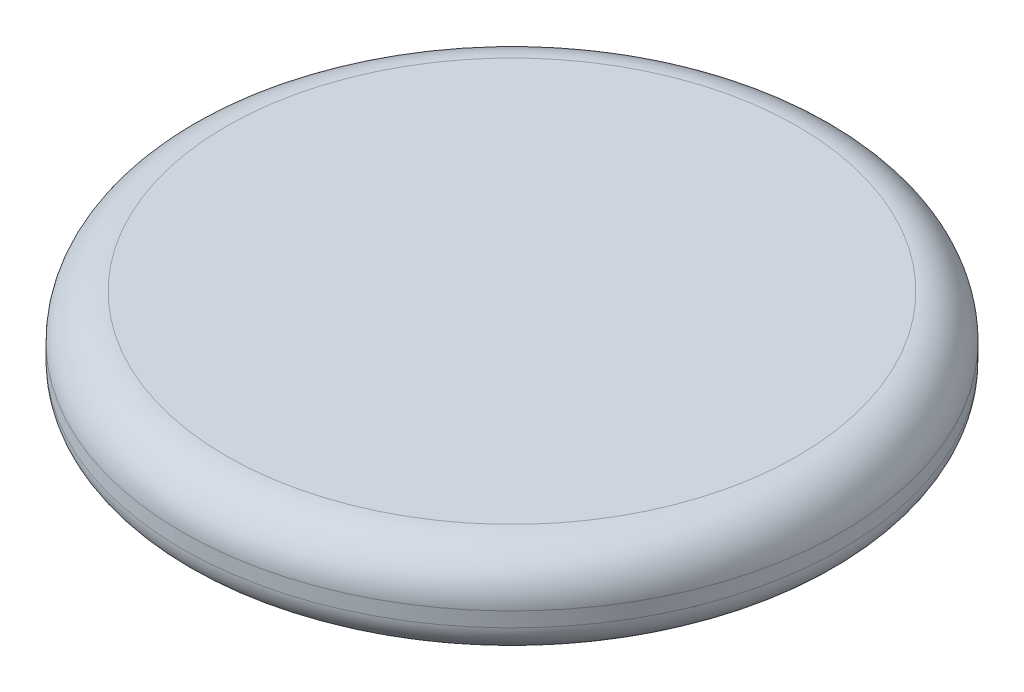
ISO-10303-21;
HEADER;
FILE_DESCRIPTION(('STEP AP214'),'2;1');
FILE_NAME('part.step','',(''),(''),'','','');
FILE_SCHEMA(('AUTOMOTIVE_DESIGN { 1 0 10303 214 1 1 1 1 }'));
ENDSEC;
DATA;
#1=APPLICATION_CONTEXT('core data for automotive mechanical design processes');
#2=APPLICATION_PROTOCOL_DEFINITION('international standard','automotive_design',2000,#1);
#3=PRODUCT_CONTEXT('',#1,'mechanical');
#4=PRODUCT('Part','Part','',(#3));
#5=PRODUCT_RELATED_PRODUCT_CATEGORY('part','',(#4));
#6=PRODUCT_DEFINITION_FORMATION('','',#4);
#7=PRODUCT_DEFINITION_CONTEXT('part definition',#1,'design');
#8=PRODUCT_DEFINITION('design','',#6,#7);
#9=PRODUCT_DEFINITION_SHAPE('','',#8);
#10=(LENGTH_UNIT() NAMED_UNIT(*) SI_UNIT(.MILLI.,.METRE.));
#11=(NAMED_UNIT(*) PLANE_ANGLE_UNIT() SI_UNIT($,.RADIAN.));
#12=(NAMED_UNIT(*) SI_UNIT($,.STERADIAN.) SOLID_ANGLE_UNIT());
#13=UNCERTAINTY_MEASURE_WITH_UNIT(LENGTH_MEASURE(1.E-05),#10,'distance_accuracy_value','');
#14=(GEOMETRIC_REPRESENTATION_CONTEXT(3) GLOBAL_UNCERTAINTY_ASSIGNED_CONTEXT((#13)) GLOBAL_UNIT_ASSIGNED_CONTEXT((#10,
#11,#12)) REPRESENTATION_CONTEXT('',''));
#15=CARTESIAN_POINT('',(0.,0.,0.));
#16=DIRECTION('',(0.,0.,1.));
#17=DIRECTION('',(1.,0.,0.));
#18=AXIS2_PLACEMENT_3D('',#15,#16,#17);
#19=CARTESIAN_POINT('',(0.,15.24,0.));
#20=DIRECTION('',(0.,-1.,0.));
#21=DIRECTION('',(0.,0.,-1.));
#22=AXIS2_PLACEMENT_3D('',#19,#20,#21);
#23=CYLINDRICAL_SURFACE('',#22,57.15);
#24=CARTESIAN_POINT('',(0.,5.08,0.));
#25=DIRECTION('',(0.,1.,0.));
#26=DIRECTION('',(0.,0.,1.));
#27=AXIS2_PLACEMENT_3D('',#24,#25,#26);
#28=CIRCLE('',#27,57.15);
#29=CARTESIAN_POINT('',(0.,5.08,-57.15));
#30=VERTEX_POINT('',#29);
#31=EDGE_CURVE('E48',#30,#30,#28,.T.);
#32=CARTESIAN_POINT('',(0.,7.62,0.));
#33=DIRECTION('',(0.,1.,0.));
#34=DIRECTION('',(0.,0.,1.));
#35=AXIS2_PLACEMENT_3D('',#32,#33,#34);
#36=CIRCLE('',#35,57.15);
#37=CARTESIAN_POINT('',(0.,7.62,-57.15));
#38=VERTEX_POINT('',#37);
#39=EDGE_CURVE('E52',#38,#38,#36,.F.);
#40=CARTESIAN_POINT('',(0.,5.08,-57.15));
#41=CARTESIAN_POINT('',(0.,5.10645833333333,-57.15));
#42=CARTESIAN_POINT('',(0.,5.13291666666666,-57.15));
#43=CARTESIAN_POINT('',(0.,5.18583333333333,-57.15));
#44=CARTESIAN_POINT('',(0.,5.21229166666666,-57.15));
#45=CARTESIAN_POINT('',(0.,5.26520833333333,-57.15));
#46=CARTESIAN_POINT('',(0.,5.29166666666667,-57.15));
#47=CARTESIAN_POINT('',(0.,5.34458333333333,-57.15));
#48=CARTESIAN_POINT('',(0.,5.37104166666666,-57.15));
#49=CARTESIAN_POINT('',(0.,5.42395833333333,-57.15));
#50=CARTESIAN_POINT('',(0.,5.45041666666666,-57.15));
#51=CARTESIAN_POINT('',(0.,5.50333333333333,-57.15));
#52=CARTESIAN_POINT('',(0.,5.52979166666666,-57.15));
#53=CARTESIAN_POINT('',(0.,5.58270833333333,-57.15));
#54=CARTESIAN_POINT('',(0.,5.60916666666667,-57.15));
#55=CARTESIAN_POINT('',(0.,5.66208333333333,-57.15));
#56=CARTESIAN_POINT('',(0.,5.68854166666666,-57.15));
#57=CARTESIAN_POINT('',(0.,5.74145833333333,-57.15));
#58=CARTESIAN_POINT('',(0.,5.76791666666666,-57.15));
#59=CARTESIAN_POINT('',(0.,5.82083333333333,-57.15));
#60=CARTESIAN_POINT('',(0.,5.84729166666666,-57.15));
#61=CARTESIAN_POINT('',(0.,5.90020833333333,-57.15));
#62=CARTESIAN_POINT('',(0.,5.92666666666666,-57.15));
#63=CARTESIAN_POINT('',(0.,5.97958333333333,-57.15));
#64=CARTESIAN_POINT('',(0.,6.00604166666666,-57.15));
#65=CARTESIAN_POINT('',(0.,6.05895833333333,-57.15));
#66=CARTESIAN_POINT('',(0.,6.08541666666667,-57.15));
#67=CARTESIAN_POINT('',(0.,6.13833333333333,-57.15));
#68=CARTESIAN_POINT('',(0.,6.16479166666667,-57.15));
#69=CARTESIAN_POINT('',(0.,6.21770833333333,-57.15));
#70=CARTESIAN_POINT('',(0.,6.24416666666666,-57.15));
#71=CARTESIAN_POINT('',(0.,6.29708333333333,-57.15));
#72=CARTESIAN_POINT('',(0.,6.32354166666666,-57.15));
#73=CARTESIAN_POINT('',(0.,6.37645833333333,-57.15));
#74=CARTESIAN_POINT('',(0.,6.40291666666667,-57.15));
#75=CARTESIAN_POINT('',(0.,6.45583333333333,-57.15));
#76=CARTESIAN_POINT('',(0.,6.48229166666667,-57.15));
#77=CARTESIAN_POINT('',(0.,6.53520833333333,-57.15));
#78=CARTESIAN_POINT('',(0.,6.56166666666667,-57.15));
#79=CARTESIAN_POINT('',(0.,6.61458333333333,-57.15));
#80=CARTESIAN_POINT('',(0.,6.64104166666667,-57.15));
#81=CARTESIAN_POINT('',(0.,6.69395833333333,-57.15));
#82=CARTESIAN_POINT('',(0.,6.72041666666667,-57.15));
#83=CARTESIAN_POINT('',(0.,6.77333333333333,-57.15));
#84=CARTESIAN_POINT('',(0.,6.79979166666667,-57.15));
#85=CARTESIAN_POINT('',(0.,6.85270833333333,-57.15));
#86=CARTESIAN_POINT('',(0.,6.87916666666667,-57.15));
#87=CARTESIAN_POINT('',(0.,6.93208333333333,-57.15));
#88=CARTESIAN_POINT('',(0.,6.95854166666667,-57.15));
#89=CARTESIAN_POINT('',(0.,7.01145833333333,-57.15));
#90=CARTESIAN_POINT('',(0.,7.03791666666667,-57.15));
#91=CARTESIAN_POINT('',(0.,7.09083333333333,-57.15));
#92=CARTESIAN_POINT('',(0.,7.11729166666667,-57.15));
#93=CARTESIAN_POINT('',(0.,7.17020833333333,-57.15));
#94=CARTESIAN_POINT('',(0.,7.19666666666667,-57.15));
#95=CARTESIAN_POINT('',(0.,7.24958333333333,-57.15));
#96=CARTESIAN_POINT('',(0.,7.27604166666667,-57.15));
#97=CARTESIAN_POINT('',(0.,7.32895833333333,-57.15));
#98=CARTESIAN_POINT('',(0.,7.35541666666667,-57.15));
#99=CARTESIAN_POINT('',(0.,7.40833333333333,-57.15));
#100=CARTESIAN_POINT('',(0.,7.43479166666667,-57.15));
#101=CARTESIAN_POINT('',(0.,7.48770833333333,-57.15));
#102=CARTESIAN_POINT('',(0.,7.51416666666667,-57.15));
#103=CARTESIAN_POINT('',(0.,7.56708333333333,-57.15));
#104=CARTESIAN_POINT('',(0.,7.59354166666667,-57.15));
#105=CARTESIAN_POINT('',(0.,7.62,-57.15));
#106=B_SPLINE_CURVE_WITH_KNOTS('',3,(#40,#41,#42,#43,#44,#45,#46,#47,#48,#49,#50,#51,#52,#53,
#54,#55,#56,#57,#58,#59,#60,#61,#62,#63,#64,#65,#66,#67,#68,#69,#70,#71,#72,#73,#74,#75,#76,#77,
#78,#79,#80,#81,#82,#83,#84,#85,#86,#87,#88,#89,#90,#91,#92,#93,#94,#95,#96,#97,#98,#99,#100,
#101,#102,#103,#104,#105),.UNSPECIFIED.,.F.,.F.,(4,2,2,2,2,2,2,2,2,2,2,2,2,2,2,2,2,2,2,2,2,2,2,
2,2,2,2,2,2,2,2,2,4),(0.,0.0793749999999996,0.158750000000001,0.238125,0.3175,0.396875,
0.476250000000001,0.555625000000001,0.635,0.714375,0.793750000000001,0.873125000000001,0.9525,
1.031875,1.11125,1.190625,1.27,1.349375,1.42875,1.508125,1.5875,1.666875,1.74625,1.825625,1.905,
1.984375,2.06375,2.143125,2.2225,2.301875,2.38125,2.460625,2.54),.UNSPECIFIED.);
#107=EDGE_CURVE('BSEAM41',#30,#38,#106,.T.);
#108=ORIENTED_EDGE('',*,*,#31,.T.);
#109=ORIENTED_EDGE('',*,*,#39,.T.);
#110=ORIENTED_EDGE('',*,*,#107,.T.);
#111=ORIENTED_EDGE('',*,*,#107,.F.);
#112=EDGE_LOOP('',(#108,#110,#109,#111));
#113=FACE_BOUND('',#112,.T.);
#114=ADVANCED_FACE('F41',(#113),#23,.T.);
#115=CARTESIAN_POINT('',(0.,15.24,0.));
#116=DIRECTION('',(0.,1.,0.));
#117=DIRECTION('',(0.,0.,1.));
#118=AXIS2_PLACEMENT_3D('',#115,#116,#117);
#119=PLANE('',#118);
#120=CARTESIAN_POINT('',(0.,15.24,0.));
#121=DIRECTION('',(0.,1.,0.));
#122=DIRECTION('',(0.,0.,1.));
#123=AXIS2_PLACEMENT_3D('',#120,#121,#122);
#124=CIRCLE('',#123,49.53);
#125=CARTESIAN_POINT('',(0.,15.24,49.53));
#126=VERTEX_POINT('',#125);
#127=EDGE_CURVE('E56',#126,#126,#124,.T.);
#128=ORIENTED_EDGE('',*,*,#127,.T.);
#129=EDGE_LOOP('',(#128));
#130=FACE_BOUND('',#129,.T.);
#131=ADVANCED_FACE('F62',(#130),#119,.T.);
#132=CARTESIAN_POINT('',(0.,0.,0.));
#133=DIRECTION('',(0.,1.,0.));
#134=DIRECTION('',(0.,0.,1.));
#135=AXIS2_PLACEMENT_3D('',#132,#133,#134);
#136=PLANE('',#135);
#137=CARTESIAN_POINT('',(0.,0.,0.));
#138=DIRECTION('',(0.,1.,0.));
#139=DIRECTION('',(0.,0.,1.));
#140=AXIS2_PLACEMENT_3D('',#137,#138,#139);
#141=CIRCLE('',#140,52.07);
#142=CARTESIAN_POINT('',(0.,0.,52.07));
#143=VERTEX_POINT('',#142);
#144=EDGE_CURVE('E10',#143,#143,#141,.F.);
#145=ORIENTED_EDGE('',*,*,#144,.T.);
#146=EDGE_LOOP('',(#145));
#147=FACE_BOUND('',#146,.T.);
#148=ADVANCED_FACE('F66',(#147),#136,.F.);
#149=CARTESIAN_POINT('',(0.,7.62,0.));
#150=DIRECTION('',(0.,1.,0.));
#151=DIRECTION('',(0.,0.,1.));
#152=AXIS2_PLACEMENT_3D('',#149,#150,#151);
#153=TOROIDAL_SURFACE('',#152,49.53,7.62);
#154=ORIENTED_EDGE('',*,*,#39,.F.);
#155=EDGE_LOOP('',(#154));
#156=FACE_BOUND('',#155,.T.);
#157=ORIENTED_EDGE('',*,*,#127,.F.);
#158=EDGE_LOOP('',(#157));
#159=FACE_BOUND('',#158,.T.);
#160=ADVANCED_FACE('F64',(#156,#159),#153,.T.);
#161=CARTESIAN_POINT('',(0.,5.08,0.));
#162=DIRECTION('',(0.,1.,0.));
#163=DIRECTION('',(0.,0.,1.));
#164=AXIS2_PLACEMENT_3D('',#161,#162,#163);
#165=TOROIDAL_SURFACE('',#164,52.07,5.08);
#166=ORIENTED_EDGE('',*,*,#144,.F.);
#167=EDGE_LOOP('',(#166));
#168=FACE_BOUND('',#167,.T.);
#169=ORIENTED_EDGE('',*,*,#31,.F.);
#170=EDGE_LOOP('',(#169));
#171=FACE_BOUND('',#170,.T.);
#172=ADVANCED_FACE('F43',(#168,#171),#165,.T.);
#173=CLOSED_SHELL('',(#114,#131,#148,#160,#172));
#174=MANIFOLD_SOLID_BREP('B2',#173);
#175=ADVANCED_BREP_SHAPE_REPRESENTATION('',(#18,#174),#14);
#176=SHAPE_DEFINITION_REPRESENTATION(#9,#175);
ENDSEC;
END-ISO-10303-21;
